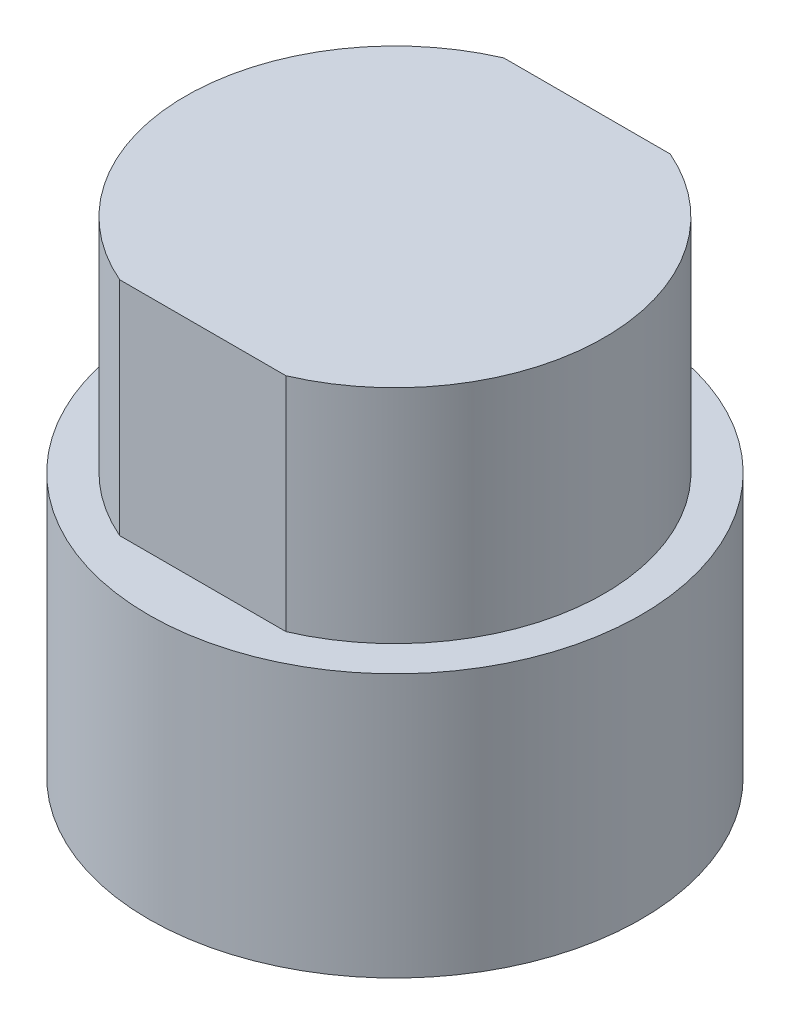
ISO-10303-21;
HEADER;
FILE_DESCRIPTION(('STEP AP214'),'2;1');
FILE_NAME('part.step','',(''),(''),'','','');
FILE_SCHEMA(('AUTOMOTIVE_DESIGN { 1 0 10303 214 1 1 1 1 }'));
ENDSEC;
DATA;
#1=APPLICATION_CONTEXT('core data for automotive mechanical design processes');
#2=APPLICATION_PROTOCOL_DEFINITION('international standard','automotive_design',2000,#1);
#3=PRODUCT_CONTEXT('',#1,'mechanical');
#4=PRODUCT('Part','Part','',(#3));
#5=PRODUCT_RELATED_PRODUCT_CATEGORY('part','',(#4));
#6=PRODUCT_DEFINITION_FORMATION('','',#4);
#7=PRODUCT_DEFINITION_CONTEXT('part definition',#1,'design');
#8=PRODUCT_DEFINITION('design','',#6,#7);
#9=PRODUCT_DEFINITION_SHAPE('','',#8);
#10=(LENGTH_UNIT() NAMED_UNIT(*) SI_UNIT(.MILLI.,.METRE.));
#11=(NAMED_UNIT(*) PLANE_ANGLE_UNIT() SI_UNIT($,.RADIAN.));
#12=(NAMED_UNIT(*) SI_UNIT($,.STERADIAN.) SOLID_ANGLE_UNIT());
#13=UNCERTAINTY_MEASURE_WITH_UNIT(LENGTH_MEASURE(1.E-05),#10,'distance_accuracy_value','');
#14=(GEOMETRIC_REPRESENTATION_CONTEXT(3) GLOBAL_UNCERTAINTY_ASSIGNED_CONTEXT((#13)) GLOBAL_UNIT_ASSIGNED_CONTEXT((#10,
#11,#12)) REPRESENTATION_CONTEXT('',''));
#15=CARTESIAN_POINT('',(0.,0.,0.));
#16=DIRECTION('',(0.,0.,1.));
#17=DIRECTION('',(1.,0.,0.));
#18=AXIS2_PLACEMENT_3D('',#15,#16,#17);
#19=CARTESIAN_POINT('',(0.,10.7,0.));
#20=DIRECTION('',(0.,-1.,0.));
#21=DIRECTION('',(0.,0.,-1.));
#22=AXIS2_PLACEMENT_3D('',#19,#20,#21);
#23=CYLINDRICAL_SURFACE('',#22,10.);
#24=CARTESIAN_POINT('',(0.,10.7,0.));
#25=DIRECTION('',(0.,1.,0.));
#26=DIRECTION('',(0.,0.,1.));
#27=AXIS2_PLACEMENT_3D('',#24,#25,#26);
#28=CIRCLE('',#27,10.);
#29=CARTESIAN_POINT('',(0.,10.7,10.));
#30=VERTEX_POINT('',#29);
#31=EDGE_CURVE('E11',#30,#30,#28,.T.);
#32=ORIENTED_EDGE('',*,*,#31,.F.);
#33=EDGE_LOOP('',(#32));
#34=FACE_BOUND('',#33,.T.);
#35=CARTESIAN_POINT('',(0.,0.,0.));
#36=DIRECTION('',(0.,1.,0.));
#37=DIRECTION('',(0.,0.,1.));
#38=AXIS2_PLACEMENT_3D('',#35,#36,#37);
#39=CIRCLE('',#38,10.);
#40=CARTESIAN_POINT('',(0.,0.,10.));
#41=VERTEX_POINT('',#40);
#42=EDGE_CURVE('E50',#41,#41,#39,.T.);
#43=ORIENTED_EDGE('',*,*,#42,.T.);
#44=EDGE_LOOP('',(#43));
#45=FACE_BOUND('',#44,.T.);
#46=ADVANCED_FACE('F47',(#34,#45),#23,.T.);
#47=CARTESIAN_POINT('',(0.,10.7,0.));
#48=DIRECTION('',(0.,1.,0.));
#49=DIRECTION('',(0.,0.,1.));
#50=AXIS2_PLACEMENT_3D('',#47,#48,#49);
#51=PLANE('',#50);
#52=DIRECTION('',(1.,0.,0.));
#53=VECTOR('',#52,1.);
#54=CARTESIAN_POINT('',(0.,10.7,7.8));
#55=LINE('',#54,#53);
#56=CARTESIAN_POINT('',(-3.37786915081091,10.7,7.8));
#57=VERTEX_POINT('',#56);
#58=CARTESIAN_POINT('',(3.37786915081091,10.7,7.8));
#59=VERTEX_POINT('',#58);
#60=EDGE_CURVE('E62',#57,#59,#55,.T.);
#61=ORIENTED_EDGE('',*,*,#60,.F.);
#62=CARTESIAN_POINT('',(0.,10.7,0.));
#63=DIRECTION('',(0.,1.,0.));
#64=DIRECTION('',(0.,0.,1.));
#65=AXIS2_PLACEMENT_3D('',#62,#63,#64);
#66=CIRCLE('',#65,8.5);
#67=CARTESIAN_POINT('',(-3.37786915081091,10.7,-7.8));
#68=VERTEX_POINT('',#67);
#69=EDGE_CURVE('E66',#68,#57,#66,.T.);
#70=ORIENTED_EDGE('',*,*,#69,.F.);
#71=DIRECTION('',(-1.,0.,0.));
#72=VECTOR('',#71,1.);
#73=CARTESIAN_POINT('',(0.,10.7,-7.8));
#74=LINE('',#73,#72);
#75=CARTESIAN_POINT('',(3.37786915081091,10.7,-7.8));
#76=VERTEX_POINT('',#75);
#77=EDGE_CURVE('E126',#76,#68,#74,.T.);
#78=ORIENTED_EDGE('',*,*,#77,.F.);
#79=CARTESIAN_POINT('',(0.,10.7,0.));
#80=DIRECTION('',(0.,1.,0.));
#81=DIRECTION('',(0.,0.,1.));
#82=AXIS2_PLACEMENT_3D('',#79,#80,#81);
#83=CIRCLE('',#82,8.5);
#84=EDGE_CURVE('E129',#59,#76,#83,.T.);
#85=ORIENTED_EDGE('',*,*,#84,.F.);
#86=EDGE_LOOP('',(#61,#70,#78,#85));
#87=FACE_BOUND('',#86,.T.);
#88=ORIENTED_EDGE('',*,*,#31,.T.);
#89=EDGE_LOOP('',(#88));
#90=FACE_BOUND('',#89,.T.);
#91=ADVANCED_FACE('F151',(#87,#90),#51,.T.);
#92=CARTESIAN_POINT('',(0.,0.,0.));
#93=DIRECTION('',(0.,1.,0.));
#94=DIRECTION('',(0.,0.,1.));
#95=AXIS2_PLACEMENT_3D('',#92,#93,#94);
#96=PLANE('',#95);
#97=ORIENTED_EDGE('',*,*,#42,.F.);
#98=EDGE_LOOP('',(#97));
#99=FACE_BOUND('',#98,.T.);
#100=ADVANCED_FACE('F156',(#99),#96,.F.);
#101=CARTESIAN_POINT('',(0.,19.7,7.8));
#102=DIRECTION('',(0.,0.,-1.));
#103=DIRECTION('',(-1.,0.,0.));
#104=AXIS2_PLACEMENT_3D('',#101,#102,#103);
#105=PLANE('',#104);
#106=ORIENTED_EDGE('',*,*,#60,.T.);
#107=DIRECTION('',(0.,-1.,0.));
#108=VECTOR('',#107,1.);
#109=CARTESIAN_POINT('',(3.37786915081091,19.7,7.8));
#110=LINE('',#109,#108);
#111=CARTESIAN_POINT('',(3.37786915081091,19.7,7.8));
#112=VERTEX_POINT('',#111);
#113=EDGE_CURVE('E91',#112,#59,#110,.T.);
#114=ORIENTED_EDGE('',*,*,#113,.F.);
#115=DIRECTION('',(1.,0.,0.));
#116=VECTOR('',#115,1.);
#117=CARTESIAN_POINT('',(0.,19.7,7.8));
#118=LINE('',#117,#116);
#119=CARTESIAN_POINT('',(-3.37786915081091,19.7,7.8));
#120=VERTEX_POINT('',#119);
#121=EDGE_CURVE('E98',#120,#112,#118,.T.);
#122=ORIENTED_EDGE('',*,*,#121,.F.);
#123=DIRECTION('',(0.,-1.,0.));
#124=VECTOR('',#123,1.);
#125=CARTESIAN_POINT('',(-3.37786915081091,19.7,7.8));
#126=LINE('',#125,#124);
#127=EDGE_CURVE('E121',#120,#57,#126,.T.);
#128=ORIENTED_EDGE('',*,*,#127,.T.);
#129=EDGE_LOOP('',(#106,#114,#122,#128));
#130=FACE_BOUND('',#129,.T.);
#131=ADVANCED_FACE('F109',(#130),#105,.F.);
#132=CARTESIAN_POINT('',(0.,19.7,0.));
#133=DIRECTION('',(0.,-1.,0.));
#134=DIRECTION('',(0.,0.,-1.));
#135=AXIS2_PLACEMENT_3D('',#132,#133,#134);
#136=CYLINDRICAL_SURFACE('',#135,8.5);
#137=ORIENTED_EDGE('',*,*,#84,.T.);
#138=DIRECTION('',(0.,-1.,0.));
#139=VECTOR('',#138,1.);
#140=CARTESIAN_POINT('',(3.37786915081091,19.7,-7.8));
#141=LINE('',#140,#139);
#142=CARTESIAN_POINT('',(3.37786915081091,19.7,-7.8));
#143=VERTEX_POINT('',#142);
#144=EDGE_CURVE('E93',#143,#76,#141,.T.);
#145=ORIENTED_EDGE('',*,*,#144,.F.);
#146=CARTESIAN_POINT('',(0.,19.7,0.));
#147=DIRECTION('',(0.,1.,0.));
#148=DIRECTION('',(0.,0.,1.));
#149=AXIS2_PLACEMENT_3D('',#146,#147,#148);
#150=CIRCLE('',#149,8.5);
#151=EDGE_CURVE('E86',#112,#143,#150,.T.);
#152=ORIENTED_EDGE('',*,*,#151,.F.);
#153=ORIENTED_EDGE('',*,*,#113,.T.);
#154=EDGE_LOOP('',(#137,#145,#152,#153));
#155=FACE_BOUND('',#154,.T.);
#156=ADVANCED_FACE('F89',(#155),#136,.T.);
#157=CARTESIAN_POINT('',(0.,19.7,-7.8));
#158=DIRECTION('',(0.,0.,1.));
#159=DIRECTION('',(1.,0.,0.));
#160=AXIS2_PLACEMENT_3D('',#157,#158,#159);
#161=PLANE('',#160);
#162=ORIENTED_EDGE('',*,*,#77,.T.);
#163=DIRECTION('',(0.,-1.,0.));
#164=VECTOR('',#163,1.);
#165=CARTESIAN_POINT('',(-3.37786915081091,19.7,-7.8));
#166=LINE('',#165,#164);
#167=CARTESIAN_POINT('',(-3.37786915081091,19.7,-7.8));
#168=VERTEX_POINT('',#167);
#169=EDGE_CURVE('E115',#168,#68,#166,.T.);
#170=ORIENTED_EDGE('',*,*,#169,.F.);
#171=DIRECTION('',(-1.,0.,0.));
#172=VECTOR('',#171,1.);
#173=CARTESIAN_POINT('',(0.,19.7,-7.8));
#174=LINE('',#173,#172);
#175=EDGE_CURVE('E97',#143,#168,#174,.T.);
#176=ORIENTED_EDGE('',*,*,#175,.F.);
#177=ORIENTED_EDGE('',*,*,#144,.T.);
#178=EDGE_LOOP('',(#162,#170,#176,#177));
#179=FACE_BOUND('',#178,.T.);
#180=ADVANCED_FACE('F139',(#179),#161,.F.);
#181=CARTESIAN_POINT('',(0.,19.7,0.));
#182=DIRECTION('',(0.,-1.,0.));
#183=DIRECTION('',(0.,0.,-1.));
#184=AXIS2_PLACEMENT_3D('',#181,#182,#183);
#185=CYLINDRICAL_SURFACE('',#184,8.5);
#186=ORIENTED_EDGE('',*,*,#69,.T.);
#187=ORIENTED_EDGE('',*,*,#127,.F.);
#188=CARTESIAN_POINT('',(0.,19.7,0.));
#189=DIRECTION('',(0.,1.,0.));
#190=DIRECTION('',(0.,0.,1.));
#191=AXIS2_PLACEMENT_3D('',#188,#189,#190);
#192=CIRCLE('',#191,8.5);
#193=EDGE_CURVE('E103',#168,#120,#192,.T.);
#194=ORIENTED_EDGE('',*,*,#193,.F.);
#195=ORIENTED_EDGE('',*,*,#169,.T.);
#196=EDGE_LOOP('',(#186,#187,#194,#195));
#197=FACE_BOUND('',#196,.T.);
#198=ADVANCED_FACE('F141',(#197),#185,.T.);
#199=CARTESIAN_POINT('',(0.,19.7,0.));
#200=DIRECTION('',(0.,1.,0.));
#201=DIRECTION('',(0.,0.,1.));
#202=AXIS2_PLACEMENT_3D('',#199,#200,#201);
#203=PLANE('',#202);
#204=ORIENTED_EDGE('',*,*,#121,.T.);
#205=ORIENTED_EDGE('',*,*,#151,.T.);
#206=ORIENTED_EDGE('',*,*,#175,.T.);
#207=ORIENTED_EDGE('',*,*,#193,.T.);
#208=EDGE_LOOP('',(#204,#205,#206,#207));
#209=FACE_BOUND('',#208,.T.);
#210=ADVANCED_FACE('F101',(#209),#203,.T.);
#211=CLOSED_SHELL('',(#46,#91,#100,#131,#156,#180,#198,#210));
#212=MANIFOLD_SOLID_BREP('B2',#211);
#213=ADVANCED_BREP_SHAPE_REPRESENTATION('',(#18,#212),#14);
#214=SHAPE_DEFINITION_REPRESENTATION(#9,#213);
ENDSEC;
END-ISO-10303-21;
